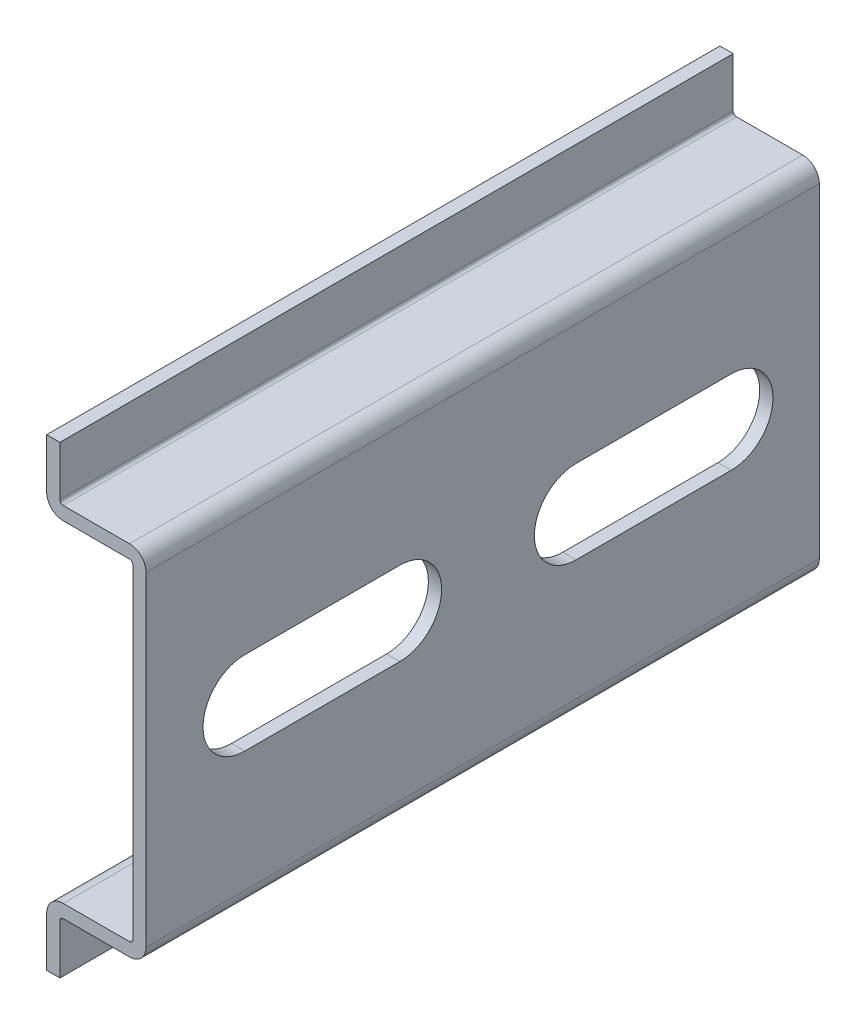
ISO-10303-21;
HEADER;
FILE_DESCRIPTION(('STEP AP214'),'2;1');
FILE_NAME('part.step','',(''),(''),'','','');
FILE_SCHEMA(('AUTOMOTIVE_DESIGN { 1 0 10303 214 1 1 1 1 }'));
ENDSEC;
DATA;
#1=APPLICATION_CONTEXT('core data for automotive mechanical design processes');
#2=APPLICATION_PROTOCOL_DEFINITION('international standard','automotive_design',2000,#1);
#3=PRODUCT_CONTEXT('',#1,'mechanical');
#4=PRODUCT('Part','Part','',(#3));
#5=PRODUCT_RELATED_PRODUCT_CATEGORY('part','',(#4));
#6=PRODUCT_DEFINITION_FORMATION('','',#4);
#7=PRODUCT_DEFINITION_CONTEXT('part definition',#1,'design');
#8=PRODUCT_DEFINITION('design','',#6,#7);
#9=PRODUCT_DEFINITION_SHAPE('','',#8);
#10=(LENGTH_UNIT() NAMED_UNIT(*) SI_UNIT(.MILLI.,.METRE.));
#11=(NAMED_UNIT(*) PLANE_ANGLE_UNIT() SI_UNIT($,.RADIAN.));
#12=(NAMED_UNIT(*) SI_UNIT($,.STERADIAN.) SOLID_ANGLE_UNIT());
#13=UNCERTAINTY_MEASURE_WITH_UNIT(LENGTH_MEASURE(1.E-05),#10,'distance_accuracy_value','');
#14=(GEOMETRIC_REPRESENTATION_CONTEXT(3) GLOBAL_UNCERTAINTY_ASSIGNED_CONTEXT((#13)) GLOBAL_UNIT_ASSIGNED_CONTEXT((#10,
#11,#12)) REPRESENTATION_CONTEXT('',''));
#15=CARTESIAN_POINT('',(0.,0.,0.));
#16=DIRECTION('',(0.,0.,1.));
#17=DIRECTION('',(1.,0.,0.));
#18=AXIS2_PLACEMENT_3D('',#15,#16,#17);
#19=CARTESIAN_POINT('',(-6.5,13.5,50.8));
#20=DIRECTION('',(-1.,0.,0.));
#21=DIRECTION('',(0.,-1.,0.));
#22=AXIS2_PLACEMENT_3D('',#19,#20,#21);
#23=PLANE('',#22);
#24=DIRECTION('',(0.,1.,0.));
#25=VECTOR('',#24,1.);
#26=CARTESIAN_POINT('',(-6.5,13.5,50.8));
#27=LINE('',#26,#25);
#28=CARTESIAN_POINT('',(-6.5,13.75,50.8));
#29=VERTEX_POINT('',#28);
#30=CARTESIAN_POINT('',(-6.5,17.5,50.8));
#31=VERTEX_POINT('',#30);
#32=EDGE_CURVE('E314',#29,#31,#27,.T.);
#33=ORIENTED_EDGE('',*,*,#32,.F.);
#34=DIRECTION('',(0.,0.,-1.));
#35=VECTOR('',#34,1.);
#36=CARTESIAN_POINT('',(-6.5,13.75,0.));
#37=LINE('',#36,#35);
#38=CARTESIAN_POINT('',(-6.5,13.75,0.));
#39=VERTEX_POINT('',#38);
#40=EDGE_CURVE('E425',#29,#39,#37,.T.);
#41=ORIENTED_EDGE('',*,*,#40,.T.);
#42=DIRECTION('',(0.,1.,0.));
#43=VECTOR('',#42,1.);
#44=CARTESIAN_POINT('',(-6.5,13.5,0.));
#45=LINE('',#44,#43);
#46=CARTESIAN_POINT('',(-6.5,17.5,0.));
#47=VERTEX_POINT('',#46);
#48=EDGE_CURVE('E313',#39,#47,#45,.T.);
#49=ORIENTED_EDGE('',*,*,#48,.T.);
#50=DIRECTION('',(0.,0.,-1.));
#51=VECTOR('',#50,1.);
#52=CARTESIAN_POINT('',(-6.5,17.5,50.8));
#53=LINE('',#52,#51);
#54=EDGE_CURVE('E394',#31,#47,#53,.T.);
#55=ORIENTED_EDGE('',*,*,#54,.F.);
#56=EDGE_LOOP('',(#33,#41,#49,#55));
#57=FACE_BOUND('',#56,.T.);
#58=ADVANCED_FACE('F41',(#57),#23,.F.);
#59=CARTESIAN_POINT('',(-7.5,17.5,50.8));
#60=DIRECTION('',(0.,1.,0.));
#61=DIRECTION('',(0.,0.,1.));
#62=AXIS2_PLACEMENT_3D('',#59,#60,#61);
#63=PLANE('',#62);
#64=DIRECTION('',(1.,0.,0.));
#65=VECTOR('',#64,1.);
#66=CARTESIAN_POINT('',(-7.5,17.5,0.));
#67=LINE('',#66,#65);
#68=CARTESIAN_POINT('',(-7.5,17.5,0.));
#69=VERTEX_POINT('',#68);
#70=EDGE_CURVE('E355',#69,#47,#67,.T.);
#71=ORIENTED_EDGE('',*,*,#70,.F.);
#72=DIRECTION('',(0.,0.,-1.));
#73=VECTOR('',#72,1.);
#74=CARTESIAN_POINT('',(-7.5,17.5,50.8));
#75=LINE('',#74,#73);
#76=CARTESIAN_POINT('',(-7.5,17.5,50.8));
#77=VERTEX_POINT('',#76);
#78=EDGE_CURVE('E390',#77,#69,#75,.T.);
#79=ORIENTED_EDGE('',*,*,#78,.F.);
#80=DIRECTION('',(1.,0.,0.));
#81=VECTOR('',#80,1.);
#82=CARTESIAN_POINT('',(-7.5,17.5,50.8));
#83=LINE('',#82,#81);
#84=EDGE_CURVE('E316',#77,#31,#83,.T.);
#85=ORIENTED_EDGE('',*,*,#84,.T.);
#86=ORIENTED_EDGE('',*,*,#54,.T.);
#87=EDGE_LOOP('',(#71,#79,#85,#86));
#88=FACE_BOUND('',#87,.T.);
#89=ADVANCED_FACE('F593',(#88),#63,.T.);
#90=CARTESIAN_POINT('',(-7.5,13.5,50.8));
#91=DIRECTION('',(-1.,0.,0.));
#92=DIRECTION('',(0.,-1.,0.));
#93=AXIS2_PLACEMENT_3D('',#90,#91,#92);
#94=PLANE('',#93);
#95=DIRECTION('',(0.,1.,0.));
#96=VECTOR('',#95,1.);
#97=CARTESIAN_POINT('',(-7.5,13.5,0.));
#98=LINE('',#97,#96);
#99=CARTESIAN_POINT('',(-7.5,13.75,0.));
#100=VERTEX_POINT('',#99);
#101=EDGE_CURVE('E359',#100,#69,#98,.T.);
#102=ORIENTED_EDGE('',*,*,#101,.F.);
#103=DIRECTION('',(0.,0.,-1.));
#104=VECTOR('',#103,1.);
#105=CARTESIAN_POINT('',(-7.5,13.75,50.8));
#106=LINE('',#105,#104);
#107=CARTESIAN_POINT('',(-7.5,13.75,50.8));
#108=VERTEX_POINT('',#107);
#109=EDGE_CURVE('E11',#100,#108,#106,.F.);
#110=ORIENTED_EDGE('',*,*,#109,.T.);
#111=DIRECTION('',(0.,1.,0.));
#112=VECTOR('',#111,1.);
#113=CARTESIAN_POINT('',(-7.5,13.5,50.8));
#114=LINE('',#113,#112);
#115=EDGE_CURVE('E320',#108,#77,#114,.T.);
#116=ORIENTED_EDGE('',*,*,#115,.T.);
#117=ORIENTED_EDGE('',*,*,#78,.T.);
#118=EDGE_LOOP('',(#102,#110,#116,#117));
#119=FACE_BOUND('',#118,.T.);
#120=ADVANCED_FACE('F597',(#119),#94,.T.);
#121=CARTESIAN_POINT('',(0.,12.5,50.8));
#122=DIRECTION('',(0.,-1.,0.));
#123=DIRECTION('',(1.,0.,0.));
#124=AXIS2_PLACEMENT_3D('',#121,#122,#123);
#125=PLANE('',#124);
#126=DIRECTION('',(-1.,0.,0.));
#127=VECTOR('',#126,1.);
#128=CARTESIAN_POINT('',(0.,12.5,50.8));
#129=LINE('',#128,#127);
#130=CARTESIAN_POINT('',(-1.25,12.5,50.8));
#131=VERTEX_POINT('',#130);
#132=CARTESIAN_POINT('',(-6.25,12.5,50.8));
#133=VERTEX_POINT('',#132);
#134=EDGE_CURVE('E322',#131,#133,#129,.T.);
#135=ORIENTED_EDGE('',*,*,#134,.T.);
#136=DIRECTION('',(0.,0.,-1.));
#137=VECTOR('',#136,1.);
#138=CARTESIAN_POINT('',(-6.25,12.5,50.8));
#139=LINE('',#138,#137);
#140=CARTESIAN_POINT('',(-6.25,12.5,0.));
#141=VERTEX_POINT('',#140);
#142=EDGE_CURVE('E50',#133,#141,#139,.T.);
#143=ORIENTED_EDGE('',*,*,#142,.T.);
#144=DIRECTION('',(-1.,0.,0.));
#145=VECTOR('',#144,1.);
#146=CARTESIAN_POINT('',(0.,12.5,0.));
#147=LINE('',#146,#145);
#148=CARTESIAN_POINT('',(-1.25,12.5,0.));
#149=VERTEX_POINT('',#148);
#150=EDGE_CURVE('E362',#149,#141,#147,.T.);
#151=ORIENTED_EDGE('',*,*,#150,.F.);
#152=DIRECTION('',(0.,0.,-1.));
#153=VECTOR('',#152,1.);
#154=CARTESIAN_POINT('',(-1.25,12.5,50.8));
#155=LINE('',#154,#153);
#156=EDGE_CURVE('E447',#149,#131,#155,.F.);
#157=ORIENTED_EDGE('',*,*,#156,.T.);
#158=EDGE_LOOP('',(#135,#143,#151,#157));
#159=FACE_BOUND('',#158,.T.);
#160=ADVANCED_FACE('F515',(#159),#125,.T.);
#161=CARTESIAN_POINT('',(-1.,-13.5,50.8));
#162=DIRECTION('',(-1.,0.,0.));
#163=DIRECTION('',(0.,-1.,0.));
#164=AXIS2_PLACEMENT_3D('',#161,#162,#163);
#165=PLANE('',#164);
#166=CARTESIAN_POINT('',(-1.,0.,31.65));
#167=DIRECTION('',(-1.,0.,0.));
#168=DIRECTION('',(0.,-1.,0.));
#169=AXIS2_PLACEMENT_3D('',#166,#167,#168);
#170=CIRCLE('',#169,3.14999999999999);
#171=CARTESIAN_POINT('',(-1.00000000000001,3.14999999999999,31.65));
#172=VERTEX_POINT('',#171);
#173=CARTESIAN_POINT('',(-1.,-3.15,31.65));
#174=VERTEX_POINT('',#173);
#175=EDGE_CURVE('E269',#172,#174,#170,.T.);
#176=ORIENTED_EDGE('',*,*,#175,.F.);
#177=DIRECTION('',(0.,0.,-1.));
#178=VECTOR('',#177,1.);
#179=CARTESIAN_POINT('',(-1.,3.14999999999999,50.8));
#180=LINE('',#179,#178);
#181=CARTESIAN_POINT('',(-1.,3.14999999999999,43.35));
#182=VERTEX_POINT('',#181);
#183=EDGE_CURVE('E251',#182,#172,#180,.T.);
#184=ORIENTED_EDGE('',*,*,#183,.F.);
#185=CARTESIAN_POINT('',(-1.,0.,43.35));
#186=DIRECTION('',(-1.,0.,0.));
#187=DIRECTION('',(0.,-1.,0.));
#188=AXIS2_PLACEMENT_3D('',#185,#186,#187);
#189=CIRCLE('',#188,3.14999999999999);
#190=CARTESIAN_POINT('',(-1.,-3.15,43.35));
#191=VERTEX_POINT('',#190);
#192=EDGE_CURVE('E263',#191,#182,#189,.T.);
#193=ORIENTED_EDGE('',*,*,#192,.F.);
#194=DIRECTION('',(0.,0.,1.));
#195=VECTOR('',#194,1.);
#196=CARTESIAN_POINT('',(-1.,-3.15,50.8));
#197=LINE('',#196,#195);
#198=EDGE_CURVE('E279',#174,#191,#197,.T.);
#199=ORIENTED_EDGE('',*,*,#198,.F.);
#200=EDGE_LOOP('',(#176,#184,#193,#199));
#201=FACE_BOUND('',#200,.T.);
#202=CARTESIAN_POINT('',(-1.,0.,6.65));
#203=DIRECTION('',(-1.,0.,0.));
#204=DIRECTION('',(0.,-1.,0.));
#205=AXIS2_PLACEMENT_3D('',#202,#203,#204);
#206=CIRCLE('',#205,3.14999999999999);
#207=CARTESIAN_POINT('',(-1.00000000000001,3.14999999999999,6.65));
#208=VERTEX_POINT('',#207);
#209=CARTESIAN_POINT('',(-1.,-3.15,6.65));
#210=VERTEX_POINT('',#209);
#211=EDGE_CURVE('E311',#208,#210,#206,.T.);
#212=ORIENTED_EDGE('',*,*,#211,.F.);
#213=DIRECTION('',(0.,0.,-1.));
#214=VECTOR('',#213,1.);
#215=CARTESIAN_POINT('',(-1.,3.15,50.8));
#216=LINE('',#215,#214);
#217=CARTESIAN_POINT('',(-1.,3.14999999999999,18.35));
#218=VERTEX_POINT('',#217);
#219=EDGE_CURVE('E297',#218,#208,#216,.T.);
#220=ORIENTED_EDGE('',*,*,#219,.F.);
#221=CARTESIAN_POINT('',(-1.,0.,18.35));
#222=DIRECTION('',(-1.,0.,0.));
#223=DIRECTION('',(0.,-1.,0.));
#224=AXIS2_PLACEMENT_3D('',#221,#222,#223);
#225=CIRCLE('',#224,3.14999999999999);
#226=CARTESIAN_POINT('',(-1.,-3.15,18.35));
#227=VERTEX_POINT('',#226);
#228=EDGE_CURVE('E304',#227,#218,#225,.T.);
#229=ORIENTED_EDGE('',*,*,#228,.F.);
#230=DIRECTION('',(0.,0.,1.));
#231=VECTOR('',#230,1.);
#232=CARTESIAN_POINT('',(-1.,-3.14999999999999,50.8));
#233=LINE('',#232,#231);
#234=EDGE_CURVE('E308',#210,#227,#233,.T.);
#235=ORIENTED_EDGE('',*,*,#234,.F.);
#236=EDGE_LOOP('',(#212,#220,#229,#235));
#237=FACE_BOUND('',#236,.T.);
#238=DIRECTION('',(0.,1.,0.));
#239=VECTOR('',#238,1.);
#240=CARTESIAN_POINT('',(-1.,-13.5,50.8));
#241=LINE('',#240,#239);
#242=CARTESIAN_POINT('',(-1.,-12.25,50.8));
#243=VERTEX_POINT('',#242);
#244=CARTESIAN_POINT('',(-1.,12.25,50.8));
#245=VERTEX_POINT('',#244);
#246=EDGE_CURVE('E325',#243,#245,#241,.T.);
#247=ORIENTED_EDGE('',*,*,#246,.T.);
#248=DIRECTION('',(0.,0.,-1.));
#249=VECTOR('',#248,1.);
#250=CARTESIAN_POINT('',(-1.,12.25,0.));
#251=LINE('',#250,#249);
#252=CARTESIAN_POINT('',(-1.,12.25,0.));
#253=VERTEX_POINT('',#252);
#254=EDGE_CURVE('E443',#245,#253,#251,.T.);
#255=ORIENTED_EDGE('',*,*,#254,.T.);
#256=DIRECTION('',(0.,1.,0.));
#257=VECTOR('',#256,1.);
#258=CARTESIAN_POINT('',(-1.,-13.5,0.));
#259=LINE('',#258,#257);
#260=CARTESIAN_POINT('',(-1.,-12.25,0.));
#261=VERTEX_POINT('',#260);
#262=EDGE_CURVE('E365',#261,#253,#259,.T.);
#263=ORIENTED_EDGE('',*,*,#262,.F.);
#264=DIRECTION('',(0.,0.,-1.));
#265=VECTOR('',#264,1.);
#266=CARTESIAN_POINT('',(-1.,-12.25,50.8));
#267=LINE('',#266,#265);
#268=EDGE_CURVE('E440',#261,#243,#267,.F.);
#269=ORIENTED_EDGE('',*,*,#268,.T.);
#270=EDGE_LOOP('',(#247,#255,#263,#269));
#271=FACE_BOUND('',#270,.T.);
#272=ADVANCED_FACE('F277',(#201,#237,#271),#165,.T.);
#273=CARTESIAN_POINT('',(0.,-12.5,50.8));
#274=DIRECTION('',(0.,1.,0.));
#275=DIRECTION('',(-1.,0.,0.));
#276=AXIS2_PLACEMENT_3D('',#273,#274,#275);
#277=PLANE('',#276);
#278=DIRECTION('',(1.,0.,0.));
#279=VECTOR('',#278,1.);
#280=CARTESIAN_POINT('',(0.,-12.5,0.));
#281=LINE('',#280,#279);
#282=CARTESIAN_POINT('',(-6.25,-12.5,0.));
#283=VERTEX_POINT('',#282);
#284=CARTESIAN_POINT('',(-1.25,-12.5,0.));
#285=VERTEX_POINT('',#284);
#286=EDGE_CURVE('E368',#283,#285,#281,.T.);
#287=ORIENTED_EDGE('',*,*,#286,.F.);
#288=DIRECTION('',(0.,0.,-1.));
#289=VECTOR('',#288,1.);
#290=CARTESIAN_POINT('',(-6.25,-12.5,50.8));
#291=LINE('',#290,#289);
#292=CARTESIAN_POINT('',(-6.25,-12.5,50.8));
#293=VERTEX_POINT('',#292);
#294=EDGE_CURVE('E486',#283,#293,#291,.F.);
#295=ORIENTED_EDGE('',*,*,#294,.T.);
#296=DIRECTION('',(1.,0.,0.));
#297=VECTOR('',#296,1.);
#298=CARTESIAN_POINT('',(0.,-12.5,50.8));
#299=LINE('',#298,#297);
#300=CARTESIAN_POINT('',(-1.25,-12.5,50.8));
#301=VERTEX_POINT('',#300);
#302=EDGE_CURVE('E329',#293,#301,#299,.T.);
#303=ORIENTED_EDGE('',*,*,#302,.T.);
#304=DIRECTION('',(0.,0.,-1.));
#305=VECTOR('',#304,1.);
#306=CARTESIAN_POINT('',(-1.25,-12.5,0.));
#307=LINE('',#306,#305);
#308=EDGE_CURVE('E450',#301,#285,#307,.T.);
#309=ORIENTED_EDGE('',*,*,#308,.T.);
#310=EDGE_LOOP('',(#287,#295,#303,#309));
#311=FACE_BOUND('',#310,.T.);
#312=ADVANCED_FACE('F540',(#311),#277,.T.);
#313=CARTESIAN_POINT('',(-7.5,-13.5,50.8));
#314=DIRECTION('',(-1.,0.,0.));
#315=DIRECTION('',(0.,-1.,0.));
#316=AXIS2_PLACEMENT_3D('',#313,#314,#315);
#317=PLANE('',#316);
#318=DIRECTION('',(0.,1.,0.));
#319=VECTOR('',#318,1.);
#320=CARTESIAN_POINT('',(-7.5,-13.5,50.8));
#321=LINE('',#320,#319);
#322=CARTESIAN_POINT('',(-7.5,-17.5,50.8));
#323=VERTEX_POINT('',#322);
#324=CARTESIAN_POINT('',(-7.5,-13.75,50.8));
#325=VERTEX_POINT('',#324);
#326=EDGE_CURVE('E332',#323,#325,#321,.T.);
#327=ORIENTED_EDGE('',*,*,#326,.T.);
#328=DIRECTION('',(0.,0.,-1.));
#329=VECTOR('',#328,1.);
#330=CARTESIAN_POINT('',(-7.5,-13.75,50.8));
#331=LINE('',#330,#329);
#332=CARTESIAN_POINT('',(-7.5,-13.75,0.));
#333=VERTEX_POINT('',#332);
#334=EDGE_CURVE('E474',#325,#333,#331,.T.);
#335=ORIENTED_EDGE('',*,*,#334,.T.);
#336=DIRECTION('',(0.,1.,0.));
#337=VECTOR('',#336,1.);
#338=CARTESIAN_POINT('',(-7.5,-13.5,0.));
#339=LINE('',#338,#337);
#340=CARTESIAN_POINT('',(-7.5,-17.5,0.));
#341=VERTEX_POINT('',#340);
#342=EDGE_CURVE('E370',#341,#333,#339,.T.);
#343=ORIENTED_EDGE('',*,*,#342,.F.);
#344=DIRECTION('',(0.,0.,-1.));
#345=VECTOR('',#344,1.);
#346=CARTESIAN_POINT('',(-7.5,-17.5,50.8));
#347=LINE('',#346,#345);
#348=EDGE_CURVE('E387',#323,#341,#347,.T.);
#349=ORIENTED_EDGE('',*,*,#348,.F.);
#350=EDGE_LOOP('',(#327,#335,#343,#349));
#351=FACE_BOUND('',#350,.T.);
#352=ADVANCED_FACE('F549',(#351),#317,.T.);
#353=CARTESIAN_POINT('',(-6.5,-17.5,50.8));
#354=DIRECTION('',(0.,-1.,0.));
#355=DIRECTION('',(0.,0.,-1.));
#356=AXIS2_PLACEMENT_3D('',#353,#354,#355);
#357=PLANE('',#356);
#358=DIRECTION('',(-1.,0.,0.));
#359=VECTOR('',#358,1.);
#360=CARTESIAN_POINT('',(-6.5,-17.5,0.));
#361=LINE('',#360,#359);
#362=CARTESIAN_POINT('',(-6.5,-17.5,0.));
#363=VERTEX_POINT('',#362);
#364=EDGE_CURVE('E373',#363,#341,#361,.T.);
#365=ORIENTED_EDGE('',*,*,#364,.F.);
#366=DIRECTION('',(0.,0.,-1.));
#367=VECTOR('',#366,1.);
#368=CARTESIAN_POINT('',(-6.5,-17.5,50.8));
#369=LINE('',#368,#367);
#370=CARTESIAN_POINT('',(-6.5,-17.5,50.8));
#371=VERTEX_POINT('',#370);
#372=EDGE_CURVE('E352',#371,#363,#369,.T.);
#373=ORIENTED_EDGE('',*,*,#372,.F.);
#374=DIRECTION('',(-1.,0.,0.));
#375=VECTOR('',#374,1.);
#376=CARTESIAN_POINT('',(-6.5,-17.5,50.8));
#377=LINE('',#376,#375);
#378=EDGE_CURVE('E336',#371,#323,#377,.T.);
#379=ORIENTED_EDGE('',*,*,#378,.T.);
#380=ORIENTED_EDGE('',*,*,#348,.T.);
#381=EDGE_LOOP('',(#365,#373,#379,#380));
#382=FACE_BOUND('',#381,.T.);
#383=ADVANCED_FACE('F553',(#382),#357,.T.);
#384=CARTESIAN_POINT('',(-6.5,-13.5,50.8));
#385=DIRECTION('',(-1.,0.,0.));
#386=DIRECTION('',(0.,-1.,0.));
#387=AXIS2_PLACEMENT_3D('',#384,#385,#386);
#388=PLANE('',#387);
#389=DIRECTION('',(0.,1.,0.));
#390=VECTOR('',#389,1.);
#391=CARTESIAN_POINT('',(-6.5,-13.5,0.));
#392=LINE('',#391,#390);
#393=CARTESIAN_POINT('',(-6.5,-13.75,0.));
#394=VERTEX_POINT('',#393);
#395=EDGE_CURVE('E376',#363,#394,#392,.T.);
#396=ORIENTED_EDGE('',*,*,#395,.T.);
#397=DIRECTION('',(0.,0.,-1.));
#398=VECTOR('',#397,1.);
#399=CARTESIAN_POINT('',(-6.5,-13.75,50.8));
#400=LINE('',#399,#398);
#401=CARTESIAN_POINT('',(-6.5,-13.75,50.8));
#402=VERTEX_POINT('',#401);
#403=EDGE_CURVE('E437',#394,#402,#400,.F.);
#404=ORIENTED_EDGE('',*,*,#403,.T.);
#405=DIRECTION('',(0.,1.,0.));
#406=VECTOR('',#405,1.);
#407=CARTESIAN_POINT('',(-6.5,-13.5,50.8));
#408=LINE('',#407,#406);
#409=EDGE_CURVE('E340',#371,#402,#408,.T.);
#410=ORIENTED_EDGE('',*,*,#409,.F.);
#411=ORIENTED_EDGE('',*,*,#372,.T.);
#412=EDGE_LOOP('',(#396,#404,#410,#411));
#413=FACE_BOUND('',#412,.T.);
#414=ADVANCED_FACE('F749',(#413),#388,.F.);
#415=CARTESIAN_POINT('',(0.,-13.5,50.8));
#416=DIRECTION('',(0.,1.,0.));
#417=DIRECTION('',(-1.,0.,0.));
#418=AXIS2_PLACEMENT_3D('',#415,#416,#417);
#419=PLANE('',#418);
#420=DIRECTION('',(1.,0.,0.));
#421=VECTOR('',#420,1.);
#422=CARTESIAN_POINT('',(0.,-13.5,0.));
#423=LINE('',#422,#421);
#424=CARTESIAN_POINT('',(-6.25,-13.5,0.));
#425=VERTEX_POINT('',#424);
#426=CARTESIAN_POINT('',(-1.25,-13.5,0.));
#427=VERTEX_POINT('',#426);
#428=EDGE_CURVE('E379',#425,#427,#423,.T.);
#429=ORIENTED_EDGE('',*,*,#428,.T.);
#430=DIRECTION('',(0.,0.,-1.));
#431=VECTOR('',#430,1.);
#432=CARTESIAN_POINT('',(-1.25,-13.5,50.8));
#433=LINE('',#432,#431);
#434=CARTESIAN_POINT('',(-1.25,-13.5,50.8));
#435=VERTEX_POINT('',#434);
#436=EDGE_CURVE('E504',#427,#435,#433,.F.);
#437=ORIENTED_EDGE('',*,*,#436,.T.);
#438=DIRECTION('',(1.,0.,0.));
#439=VECTOR('',#438,1.);
#440=CARTESIAN_POINT('',(0.,-13.5,50.8));
#441=LINE('',#440,#439);
#442=CARTESIAN_POINT('',(-6.25,-13.5,50.8));
#443=VERTEX_POINT('',#442);
#444=EDGE_CURVE('E344',#443,#435,#441,.T.);
#445=ORIENTED_EDGE('',*,*,#444,.F.);
#446=DIRECTION('',(0.,0.,-1.));
#447=VECTOR('',#446,1.);
#448=CARTESIAN_POINT('',(-6.25,-13.5,0.));
#449=LINE('',#448,#447);
#450=EDGE_CURVE('E433',#443,#425,#449,.T.);
#451=ORIENTED_EDGE('',*,*,#450,.T.);
#452=EDGE_LOOP('',(#429,#437,#445,#451));
#453=FACE_BOUND('',#452,.T.);
#454=ADVANCED_FACE('F565',(#453),#419,.F.);
#455=CARTESIAN_POINT('',(0.,-13.5,50.8));
#456=DIRECTION('',(-1.,0.,0.));
#457=DIRECTION('',(0.,-1.,0.));
#458=AXIS2_PLACEMENT_3D('',#455,#456,#457);
#459=PLANE('',#458);
#460=DIRECTION('',(0.,0.,1.));
#461=VECTOR('',#460,1.);
#462=CARTESIAN_POINT('',(0.,3.14999999999999,50.8));
#463=LINE('',#462,#461);
#464=CARTESIAN_POINT('',(0.,3.15,43.35));
#465=VERTEX_POINT('',#464);
#466=CARTESIAN_POINT('',(0.,3.14999999999999,31.65));
#467=VERTEX_POINT('',#466);
#468=EDGE_CURVE('E413',#465,#467,#463,.F.);
#469=ORIENTED_EDGE('',*,*,#468,.T.);
#470=CARTESIAN_POINT('',(0.,0.,31.65));
#471=DIRECTION('',(1.,0.,0.));
#472=DIRECTION('',(0.,0.,-1.));
#473=AXIS2_PLACEMENT_3D('',#470,#471,#472);
#474=CIRCLE('',#473,3.14999999999999);
#475=CARTESIAN_POINT('',(0.,-3.15,31.65));
#476=VERTEX_POINT('',#475);
#477=EDGE_CURVE('E272',#467,#476,#474,.F.);
#478=ORIENTED_EDGE('',*,*,#477,.T.);
#479=DIRECTION('',(0.,0.,1.));
#480=VECTOR('',#479,1.);
#481=CARTESIAN_POINT('',(0.,-3.15,50.8));
#482=LINE('',#481,#480);
#483=CARTESIAN_POINT('',(0.,-3.15,43.35));
#484=VERTEX_POINT('',#483);
#485=EDGE_CURVE('E419',#476,#484,#482,.T.);
#486=ORIENTED_EDGE('',*,*,#485,.T.);
#487=CARTESIAN_POINT('',(0.,0.,43.35));
#488=DIRECTION('',(1.,0.,0.));
#489=DIRECTION('',(0.,0.,-1.));
#490=AXIS2_PLACEMENT_3D('',#487,#488,#489);
#491=CIRCLE('',#490,3.14999999999999);
#492=EDGE_CURVE('E415',#484,#465,#491,.F.);
#493=ORIENTED_EDGE('',*,*,#492,.T.);
#494=EDGE_LOOP('',(#469,#478,#486,#493));
#495=FACE_BOUND('',#494,.T.);
#496=DIRECTION('',(0.,0.,1.));
#497=VECTOR('',#496,1.);
#498=CARTESIAN_POINT('',(0.,3.14999999999999,50.8));
#499=LINE('',#498,#497);
#500=CARTESIAN_POINT('',(0.,3.15,18.35));
#501=VERTEX_POINT('',#500);
#502=CARTESIAN_POINT('',(0.,3.14999999999999,6.65));
#503=VERTEX_POINT('',#502);
#504=EDGE_CURVE('E398',#501,#503,#499,.F.);
#505=ORIENTED_EDGE('',*,*,#504,.T.);
#506=CARTESIAN_POINT('',(0.,0.,6.65));
#507=DIRECTION('',(1.,0.,0.));
#508=DIRECTION('',(0.,0.,-1.));
#509=AXIS2_PLACEMENT_3D('',#506,#507,#508);
#510=CIRCLE('',#509,3.14999999999999);
#511=CARTESIAN_POINT('',(0.,-3.15,6.65));
#512=VERTEX_POINT('',#511);
#513=EDGE_CURVE('E410',#503,#512,#510,.F.);
#514=ORIENTED_EDGE('',*,*,#513,.T.);
#515=DIRECTION('',(0.,0.,1.));
#516=VECTOR('',#515,1.);
#517=CARTESIAN_POINT('',(0.,-3.15,50.8));
#518=LINE('',#517,#516);
#519=CARTESIAN_POINT('',(0.,-3.15,18.35));
#520=VERTEX_POINT('',#519);
#521=EDGE_CURVE('E406',#512,#520,#518,.T.);
#522=ORIENTED_EDGE('',*,*,#521,.T.);
#523=CARTESIAN_POINT('',(0.,0.,18.35));
#524=DIRECTION('',(1.,0.,0.));
#525=DIRECTION('',(0.,0.,-1.));
#526=AXIS2_PLACEMENT_3D('',#523,#524,#525);
#527=CIRCLE('',#526,3.14999999999999);
#528=EDGE_CURVE('E402',#520,#501,#527,.F.);
#529=ORIENTED_EDGE('',*,*,#528,.T.);
#530=EDGE_LOOP('',(#505,#514,#522,#529));
#531=FACE_BOUND('',#530,.T.);
#532=DIRECTION('',(0.,1.,0.));
#533=VECTOR('',#532,1.);
#534=CARTESIAN_POINT('',(0.,-13.5,50.8));
#535=LINE('',#534,#533);
#536=CARTESIAN_POINT('',(0.,-12.25,50.8));
#537=VERTEX_POINT('',#536);
#538=CARTESIAN_POINT('',(0.,12.25,50.8));
#539=VERTEX_POINT('',#538);
#540=EDGE_CURVE('E347',#537,#539,#535,.T.);
#541=ORIENTED_EDGE('',*,*,#540,.F.);
#542=DIRECTION('',(0.,0.,-1.));
#543=VECTOR('',#542,1.);
#544=CARTESIAN_POINT('',(0.,-12.25,50.8));
#545=LINE('',#544,#543);
#546=CARTESIAN_POINT('',(0.,-12.25,0.));
#547=VERTEX_POINT('',#546);
#548=EDGE_CURVE('E500',#537,#547,#545,.T.);
#549=ORIENTED_EDGE('',*,*,#548,.T.);
#550=DIRECTION('',(0.,1.,0.));
#551=VECTOR('',#550,1.);
#552=CARTESIAN_POINT('',(0.,-13.5,0.));
#553=LINE('',#552,#551);
#554=CARTESIAN_POINT('',(0.,12.25,0.));
#555=VERTEX_POINT('',#554);
#556=EDGE_CURVE('E382',#547,#555,#553,.T.);
#557=ORIENTED_EDGE('',*,*,#556,.T.);
#558=DIRECTION('',(0.,0.,-1.));
#559=VECTOR('',#558,1.);
#560=CARTESIAN_POINT('',(0.,12.25,50.8));
#561=LINE('',#560,#559);
#562=EDGE_CURVE('E57',#555,#539,#561,.F.);
#563=ORIENTED_EDGE('',*,*,#562,.T.);
#564=EDGE_LOOP('',(#541,#549,#557,#563));
#565=FACE_BOUND('',#564,.T.);
#566=ADVANCED_FACE('F571',(#495,#531,#565),#459,.F.);
#567=CARTESIAN_POINT('',(0.,13.5,50.8));
#568=DIRECTION('',(0.,-1.,0.));
#569=DIRECTION('',(1.,0.,0.));
#570=AXIS2_PLACEMENT_3D('',#567,#568,#569);
#571=PLANE('',#570);
#572=DIRECTION('',(-1.,0.,0.));
#573=VECTOR('',#572,1.);
#574=CARTESIAN_POINT('',(0.,13.5,50.8));
#575=LINE('',#574,#573);
#576=CARTESIAN_POINT('',(-1.25000000000001,13.5,50.8));
#577=VERTEX_POINT('',#576);
#578=CARTESIAN_POINT('',(-6.25,13.5,50.8));
#579=VERTEX_POINT('',#578);
#580=EDGE_CURVE('E350',#577,#579,#575,.T.);
#581=ORIENTED_EDGE('',*,*,#580,.F.);
#582=DIRECTION('',(0.,0.,-1.));
#583=VECTOR('',#582,1.);
#584=CARTESIAN_POINT('',(-1.25000000000001,13.5,50.8));
#585=LINE('',#584,#583);
#586=CARTESIAN_POINT('',(-1.25000000000001,13.5,0.));
#587=VERTEX_POINT('',#586);
#588=EDGE_CURVE('E507',#577,#587,#585,.T.);
#589=ORIENTED_EDGE('',*,*,#588,.T.);
#590=DIRECTION('',(-1.,0.,0.));
#591=VECTOR('',#590,1.);
#592=CARTESIAN_POINT('',(0.,13.5,0.));
#593=LINE('',#592,#591);
#594=CARTESIAN_POINT('',(-6.25,13.5,0.));
#595=VERTEX_POINT('',#594);
#596=EDGE_CURVE('E317',#587,#595,#593,.T.);
#597=ORIENTED_EDGE('',*,*,#596,.T.);
#598=DIRECTION('',(0.,0.,-1.));
#599=VECTOR('',#598,1.);
#600=CARTESIAN_POINT('',(-6.25,13.5,50.8));
#601=LINE('',#600,#599);
#602=EDGE_CURVE('E429',#595,#579,#601,.F.);
#603=ORIENTED_EDGE('',*,*,#602,.T.);
#604=EDGE_LOOP('',(#581,#589,#597,#603));
#605=FACE_BOUND('',#604,.T.);
#606=ADVANCED_FACE('F579',(#605),#571,.F.);
#607=CARTESIAN_POINT('',(0.,0.,50.8));
#608=DIRECTION('',(0.,0.,-1.));
#609=DIRECTION('',(-1.,0.,0.));
#610=AXIS2_PLACEMENT_3D('',#607,#608,#609);
#611=PLANE('',#610);
#612=ORIENTED_EDGE('',*,*,#302,.F.);
#613=CARTESIAN_POINT('',(-6.25,-13.75,50.8));
#614=DIRECTION('',(0.,0.,-1.));
#615=DIRECTION('',(-1.,0.,0.));
#616=AXIS2_PLACEMENT_3D('',#613,#614,#615);
#617=CIRCLE('',#616,1.25);
#618=EDGE_CURVE('E495',#293,#325,#617,.F.);
#619=ORIENTED_EDGE('',*,*,#618,.T.);
#620=ORIENTED_EDGE('',*,*,#326,.F.);
#621=ORIENTED_EDGE('',*,*,#378,.F.);
#622=ORIENTED_EDGE('',*,*,#409,.T.);
#623=CARTESIAN_POINT('',(-6.25,-13.75,50.8));
#624=DIRECTION('',(0.,0.,-1.));
#625=DIRECTION('',(-1.,0.,0.));
#626=AXIS2_PLACEMENT_3D('',#623,#624,#625);
#627=CIRCLE('',#626,0.25);
#628=EDGE_CURVE('E461',#402,#443,#627,.T.);
#629=ORIENTED_EDGE('',*,*,#628,.T.);
#630=ORIENTED_EDGE('',*,*,#444,.T.);
#631=CARTESIAN_POINT('',(-1.25,-12.25,50.8));
#632=DIRECTION('',(0.,0.,-1.));
#633=DIRECTION('',(-1.,0.,0.));
#634=AXIS2_PLACEMENT_3D('',#631,#632,#633);
#635=CIRCLE('',#634,1.25);
#636=EDGE_CURVE('E67',#435,#537,#635,.F.);
#637=ORIENTED_EDGE('',*,*,#636,.T.);
#638=ORIENTED_EDGE('',*,*,#540,.T.);
#639=CARTESIAN_POINT('',(-1.25,12.25,50.8));
#640=DIRECTION('',(0.,0.,-1.));
#641=DIRECTION('',(-1.,0.,0.));
#642=AXIS2_PLACEMENT_3D('',#639,#640,#641);
#643=CIRCLE('',#642,1.25);
#644=EDGE_CURVE('E491',#539,#577,#643,.F.);
#645=ORIENTED_EDGE('',*,*,#644,.T.);
#646=ORIENTED_EDGE('',*,*,#580,.T.);
#647=CARTESIAN_POINT('',(-6.25,13.75,50.8));
#648=DIRECTION('',(0.,0.,-1.));
#649=DIRECTION('',(-1.,0.,0.));
#650=AXIS2_PLACEMENT_3D('',#647,#648,#649);
#651=CIRCLE('',#650,0.25);
#652=EDGE_CURVE('E457',#579,#29,#651,.T.);
#653=ORIENTED_EDGE('',*,*,#652,.T.);
#654=ORIENTED_EDGE('',*,*,#32,.T.);
#655=ORIENTED_EDGE('',*,*,#84,.F.);
#656=ORIENTED_EDGE('',*,*,#115,.F.);
#657=CARTESIAN_POINT('',(-6.25,13.75,50.8));
#658=DIRECTION('',(0.,0.,-1.));
#659=DIRECTION('',(-1.,0.,0.));
#660=AXIS2_PLACEMENT_3D('',#657,#658,#659);
#661=CIRCLE('',#660,1.25);
#662=EDGE_CURVE('E489',#108,#133,#661,.F.);
#663=ORIENTED_EDGE('',*,*,#662,.T.);
#664=ORIENTED_EDGE('',*,*,#134,.F.);
#665=CARTESIAN_POINT('',(-1.25,12.25,50.8));
#666=DIRECTION('',(0.,0.,-1.));
#667=DIRECTION('',(-1.,0.,0.));
#668=AXIS2_PLACEMENT_3D('',#665,#666,#667);
#669=CIRCLE('',#668,0.25);
#670=EDGE_CURVE('E466',#131,#245,#669,.T.);
#671=ORIENTED_EDGE('',*,*,#670,.T.);
#672=ORIENTED_EDGE('',*,*,#246,.F.);
#673=CARTESIAN_POINT('',(-1.25,-12.25,50.8));
#674=DIRECTION('',(0.,0.,-1.));
#675=DIRECTION('',(-1.,0.,0.));
#676=AXIS2_PLACEMENT_3D('',#673,#674,#675);
#677=CIRCLE('',#676,0.25);
#678=EDGE_CURVE('E470',#243,#301,#677,.T.);
#679=ORIENTED_EDGE('',*,*,#678,.T.);
#680=EDGE_LOOP('',(#612,#619,#620,#621,#622,#629,#630,#637,#638,#645,#646,#653,#654,#655,#656,
#663,#664,#671,#672,#679));
#681=FACE_BOUND('',#680,.T.);
#682=ADVANCED_FACE('F533',(#681),#611,.F.);
#683=CARTESIAN_POINT('',(0.,0.,0.));
#684=DIRECTION('',(0.,0.,-1.));
#685=DIRECTION('',(-1.,0.,0.));
#686=AXIS2_PLACEMENT_3D('',#683,#684,#685);
#687=PLANE('',#686);
#688=ORIENTED_EDGE('',*,*,#342,.T.);
#689=CARTESIAN_POINT('',(-6.25,-13.75,0.));
#690=DIRECTION('',(0.,0.,-1.));
#691=DIRECTION('',(-1.,0.,0.));
#692=AXIS2_PLACEMENT_3D('',#689,#690,#691);
#693=CIRCLE('',#692,1.25);
#694=EDGE_CURVE('E484',#333,#283,#693,.T.);
#695=ORIENTED_EDGE('',*,*,#694,.T.);
#696=ORIENTED_EDGE('',*,*,#286,.T.);
#697=CARTESIAN_POINT('',(-1.25,-12.25,0.));
#698=DIRECTION('',(0.,0.,-1.));
#699=DIRECTION('',(-1.,0.,0.));
#700=AXIS2_PLACEMENT_3D('',#697,#698,#699);
#701=CIRCLE('',#700,0.25);
#702=EDGE_CURVE('E468',#285,#261,#701,.F.);
#703=ORIENTED_EDGE('',*,*,#702,.T.);
#704=ORIENTED_EDGE('',*,*,#262,.T.);
#705=CARTESIAN_POINT('',(-1.25,12.25,0.));
#706=DIRECTION('',(0.,0.,-1.));
#707=DIRECTION('',(-1.,0.,0.));
#708=AXIS2_PLACEMENT_3D('',#705,#706,#707);
#709=CIRCLE('',#708,0.25);
#710=EDGE_CURVE('E464',#253,#149,#709,.F.);
#711=ORIENTED_EDGE('',*,*,#710,.T.);
#712=ORIENTED_EDGE('',*,*,#150,.T.);
#713=CARTESIAN_POINT('',(-6.25,13.75,0.));
#714=DIRECTION('',(0.,0.,-1.));
#715=DIRECTION('',(-1.,0.,0.));
#716=AXIS2_PLACEMENT_3D('',#713,#714,#715);
#717=CIRCLE('',#716,1.25);
#718=EDGE_CURVE('E478',#141,#100,#717,.T.);
#719=ORIENTED_EDGE('',*,*,#718,.T.);
#720=ORIENTED_EDGE('',*,*,#101,.T.);
#721=ORIENTED_EDGE('',*,*,#70,.T.);
#722=ORIENTED_EDGE('',*,*,#48,.F.);
#723=CARTESIAN_POINT('',(-6.25,13.75,0.));
#724=DIRECTION('',(0.,0.,-1.));
#725=DIRECTION('',(-1.,0.,0.));
#726=AXIS2_PLACEMENT_3D('',#723,#724,#725);
#727=CIRCLE('',#726,0.25);
#728=EDGE_CURVE('E454',#39,#595,#727,.F.);
#729=ORIENTED_EDGE('',*,*,#728,.T.);
#730=ORIENTED_EDGE('',*,*,#596,.F.);
#731=CARTESIAN_POINT('',(-1.25,12.25,0.));
#732=DIRECTION('',(0.,0.,-1.));
#733=DIRECTION('',(-1.,0.,0.));
#734=AXIS2_PLACEMENT_3D('',#731,#732,#733);
#735=CIRCLE('',#734,1.25);
#736=EDGE_CURVE('E480',#587,#555,#735,.T.);
#737=ORIENTED_EDGE('',*,*,#736,.T.);
#738=ORIENTED_EDGE('',*,*,#556,.F.);
#739=CARTESIAN_POINT('',(-1.25,-12.25,0.));
#740=DIRECTION('',(0.,0.,-1.));
#741=DIRECTION('',(-1.,0.,0.));
#742=AXIS2_PLACEMENT_3D('',#739,#740,#741);
#743=CIRCLE('',#742,1.25);
#744=EDGE_CURVE('E482',#547,#427,#743,.T.);
#745=ORIENTED_EDGE('',*,*,#744,.T.);
#746=ORIENTED_EDGE('',*,*,#428,.F.);
#747=CARTESIAN_POINT('',(-6.25,-13.75,0.));
#748=DIRECTION('',(0.,0.,-1.));
#749=DIRECTION('',(-1.,0.,0.));
#750=AXIS2_PLACEMENT_3D('',#747,#748,#749);
#751=CIRCLE('',#750,0.25);
#752=EDGE_CURVE('E459',#425,#394,#751,.F.);
#753=ORIENTED_EDGE('',*,*,#752,.T.);
#754=ORIENTED_EDGE('',*,*,#395,.F.);
#755=ORIENTED_EDGE('',*,*,#364,.T.);
#756=EDGE_LOOP('',(#688,#695,#696,#703,#704,#711,#712,#719,#720,#721,#722,#729,#730,#737,#738,
#745,#746,#753,#754,#755));
#757=FACE_BOUND('',#756,.T.);
#758=ADVANCED_FACE('F521',(#757),#687,.T.);
#759=CARTESIAN_POINT('',(-7.5,0.,6.65));
#760=DIRECTION('',(1.,0.,0.));
#761=DIRECTION('',(0.,0.,-1.));
#762=AXIS2_PLACEMENT_3D('',#759,#760,#761);
#763=CYLINDRICAL_SURFACE('',#762,3.14999999999999);
#764=ORIENTED_EDGE('',*,*,#211,.T.);
#765=DIRECTION('',(1.,0.,0.));
#766=VECTOR('',#765,1.);
#767=CARTESIAN_POINT('',(-7.5,-3.15,6.65));
#768=LINE('',#767,#766);
#769=EDGE_CURVE('E295',#210,#512,#768,.T.);
#770=ORIENTED_EDGE('',*,*,#769,.T.);
#771=ORIENTED_EDGE('',*,*,#513,.F.);
#772=DIRECTION('',(1.,0.,0.));
#773=VECTOR('',#772,1.);
#774=CARTESIAN_POINT('',(-7.5,3.14999999999999,6.65));
#775=LINE('',#774,#773);
#776=EDGE_CURVE('E281',#208,#503,#775,.T.);
#777=ORIENTED_EDGE('',*,*,#776,.F.);
#778=EDGE_LOOP('',(#764,#770,#771,#777));
#779=FACE_BOUND('',#778,.T.);
#780=ADVANCED_FACE('F709',(#779),#763,.F.);
#781=CARTESIAN_POINT('',(-7.5,-3.15,6.65));
#782=DIRECTION('',(0.,-1.,0.));
#783=DIRECTION('',(0.,0.,-1.));
#784=AXIS2_PLACEMENT_3D('',#781,#782,#783);
#785=PLANE('',#784);
#786=ORIENTED_EDGE('',*,*,#234,.T.);
#787=DIRECTION('',(1.,0.,0.));
#788=VECTOR('',#787,1.);
#789=CARTESIAN_POINT('',(-7.5,-3.15,18.35));
#790=LINE('',#789,#788);
#791=EDGE_CURVE('E291',#227,#520,#790,.T.);
#792=ORIENTED_EDGE('',*,*,#791,.T.);
#793=ORIENTED_EDGE('',*,*,#521,.F.);
#794=ORIENTED_EDGE('',*,*,#769,.F.);
#795=EDGE_LOOP('',(#786,#792,#793,#794));
#796=FACE_BOUND('',#795,.T.);
#797=ADVANCED_FACE('F701',(#796),#785,.F.);
#798=CARTESIAN_POINT('',(-7.5,0.,18.35));
#799=DIRECTION('',(1.,0.,0.));
#800=DIRECTION('',(0.,0.,-1.));
#801=AXIS2_PLACEMENT_3D('',#798,#799,#800);
#802=CYLINDRICAL_SURFACE('',#801,3.14999999999999);
#803=ORIENTED_EDGE('',*,*,#228,.T.);
#804=DIRECTION('',(1.,0.,0.));
#805=VECTOR('',#804,1.);
#806=CARTESIAN_POINT('',(-7.5,3.15000000000001,18.35));
#807=LINE('',#806,#805);
#808=EDGE_CURVE('E285',#218,#501,#807,.T.);
#809=ORIENTED_EDGE('',*,*,#808,.T.);
#810=ORIENTED_EDGE('',*,*,#528,.F.);
#811=ORIENTED_EDGE('',*,*,#791,.F.);
#812=EDGE_LOOP('',(#803,#809,#810,#811));
#813=FACE_BOUND('',#812,.T.);
#814=ADVANCED_FACE('F693',(#813),#802,.F.);
#815=CARTESIAN_POINT('',(-7.5,3.14999999999999,6.65));
#816=DIRECTION('',(0.,1.,0.));
#817=DIRECTION('',(0.,0.,1.));
#818=AXIS2_PLACEMENT_3D('',#815,#816,#817);
#819=PLANE('',#818);
#820=ORIENTED_EDGE('',*,*,#219,.T.);
#821=ORIENTED_EDGE('',*,*,#776,.T.);
#822=ORIENTED_EDGE('',*,*,#504,.F.);
#823=ORIENTED_EDGE('',*,*,#808,.F.);
#824=EDGE_LOOP('',(#820,#821,#822,#823));
#825=FACE_BOUND('',#824,.T.);
#826=ADVANCED_FACE('F686',(#825),#819,.F.);
#827=CARTESIAN_POINT('',(-7.5,0.,31.65));
#828=DIRECTION('',(1.,0.,0.));
#829=DIRECTION('',(0.,0.,-1.));
#830=AXIS2_PLACEMENT_3D('',#827,#828,#829);
#831=CYLINDRICAL_SURFACE('',#830,3.14999999999999);
#832=ORIENTED_EDGE('',*,*,#175,.T.);
#833=DIRECTION('',(1.,0.,0.));
#834=VECTOR('',#833,1.);
#835=CARTESIAN_POINT('',(-7.5,-3.15,31.65));
#836=LINE('',#835,#834);
#837=EDGE_CURVE('E264',#174,#476,#836,.T.);
#838=ORIENTED_EDGE('',*,*,#837,.T.);
#839=ORIENTED_EDGE('',*,*,#477,.F.);
#840=DIRECTION('',(1.,0.,0.));
#841=VECTOR('',#840,1.);
#842=CARTESIAN_POINT('',(-7.5,3.14999999999999,31.65));
#843=LINE('',#842,#841);
#844=EDGE_CURVE('E254',#172,#467,#843,.T.);
#845=ORIENTED_EDGE('',*,*,#844,.F.);
#846=EDGE_LOOP('',(#832,#838,#839,#845));
#847=FACE_BOUND('',#846,.T.);
#848=ADVANCED_FACE('F267',(#847),#831,.F.);
#849=CARTESIAN_POINT('',(-7.5,-3.15,31.65));
#850=DIRECTION('',(0.,-1.,0.));
#851=DIRECTION('',(0.,0.,-1.));
#852=AXIS2_PLACEMENT_3D('',#849,#850,#851);
#853=PLANE('',#852);
#854=ORIENTED_EDGE('',*,*,#198,.T.);
#855=DIRECTION('',(1.,0.,0.));
#856=VECTOR('',#855,1.);
#857=CARTESIAN_POINT('',(-7.5,-3.15,43.35));
#858=LINE('',#857,#856);
#859=EDGE_CURVE('E802',#191,#484,#858,.T.);
#860=ORIENTED_EDGE('',*,*,#859,.T.);
#861=ORIENTED_EDGE('',*,*,#485,.F.);
#862=ORIENTED_EDGE('',*,*,#837,.F.);
#863=EDGE_LOOP('',(#854,#860,#861,#862));
#864=FACE_BOUND('',#863,.T.);
#865=ADVANCED_FACE('F671',(#864),#853,.F.);
#866=CARTESIAN_POINT('',(-7.5,0.,43.35));
#867=DIRECTION('',(1.,0.,0.));
#868=DIRECTION('',(0.,0.,-1.));
#869=AXIS2_PLACEMENT_3D('',#866,#867,#868);
#870=CYLINDRICAL_SURFACE('',#869,3.14999999999999);
#871=ORIENTED_EDGE('',*,*,#192,.T.);
#872=DIRECTION('',(1.,0.,0.));
#873=VECTOR('',#872,1.);
#874=CARTESIAN_POINT('',(-7.5,3.15000000000001,43.35));
#875=LINE('',#874,#873);
#876=EDGE_CURVE('E257',#182,#465,#875,.T.);
#877=ORIENTED_EDGE('',*,*,#876,.T.);
#878=ORIENTED_EDGE('',*,*,#492,.F.);
#879=ORIENTED_EDGE('',*,*,#859,.F.);
#880=EDGE_LOOP('',(#871,#877,#878,#879));
#881=FACE_BOUND('',#880,.T.);
#882=ADVANCED_FACE('F664',(#881),#870,.F.);
#883=CARTESIAN_POINT('',(-7.5,3.14999999999999,31.65));
#884=DIRECTION('',(0.,1.,0.));
#885=DIRECTION('',(0.,0.,1.));
#886=AXIS2_PLACEMENT_3D('',#883,#884,#885);
#887=PLANE('',#886);
#888=ORIENTED_EDGE('',*,*,#183,.T.);
#889=ORIENTED_EDGE('',*,*,#844,.T.);
#890=ORIENTED_EDGE('',*,*,#468,.F.);
#891=ORIENTED_EDGE('',*,*,#876,.F.);
#892=EDGE_LOOP('',(#888,#889,#890,#891));
#893=FACE_BOUND('',#892,.T.);
#894=ADVANCED_FACE('F253',(#893),#887,.F.);
#895=CARTESIAN_POINT('',(-6.25,13.75,50.8));
#896=DIRECTION('',(0.,0.,1.));
#897=DIRECTION('',(1.,0.,0.));
#898=AXIS2_PLACEMENT_3D('',#895,#896,#897);
#899=CYLINDRICAL_SURFACE('',#898,0.25);
#900=ORIENTED_EDGE('',*,*,#652,.F.);
#901=ORIENTED_EDGE('',*,*,#602,.F.);
#902=ORIENTED_EDGE('',*,*,#728,.F.);
#903=ORIENTED_EDGE('',*,*,#40,.F.);
#904=EDGE_LOOP('',(#900,#901,#902,#903));
#905=FACE_BOUND('',#904,.T.);
#906=ADVANCED_FACE('F585',(#905),#899,.F.);
#907=CARTESIAN_POINT('',(-6.25,-13.75,50.8));
#908=DIRECTION('',(0.,0.,1.));
#909=DIRECTION('',(1.,0.,0.));
#910=AXIS2_PLACEMENT_3D('',#907,#908,#909);
#911=CYLINDRICAL_SURFACE('',#910,0.25);
#912=ORIENTED_EDGE('',*,*,#628,.F.);
#913=ORIENTED_EDGE('',*,*,#403,.F.);
#914=ORIENTED_EDGE('',*,*,#752,.F.);
#915=ORIENTED_EDGE('',*,*,#450,.F.);
#916=EDGE_LOOP('',(#912,#913,#914,#915));
#917=FACE_BOUND('',#916,.T.);
#918=ADVANCED_FACE('F562',(#917),#911,.F.);
#919=CARTESIAN_POINT('',(-1.25,12.25,50.8));
#920=DIRECTION('',(0.,0.,1.));
#921=DIRECTION('',(1.,0.,0.));
#922=AXIS2_PLACEMENT_3D('',#919,#920,#921);
#923=CYLINDRICAL_SURFACE('',#922,0.25);
#924=ORIENTED_EDGE('',*,*,#670,.F.);
#925=ORIENTED_EDGE('',*,*,#156,.F.);
#926=ORIENTED_EDGE('',*,*,#710,.F.);
#927=ORIENTED_EDGE('',*,*,#254,.F.);
#928=EDGE_LOOP('',(#924,#925,#926,#927));
#929=FACE_BOUND('',#928,.T.);
#930=ADVANCED_FACE('F527',(#929),#923,.F.);
#931=CARTESIAN_POINT('',(-1.25,-12.25,50.8));
#932=DIRECTION('',(0.,0.,1.));
#933=DIRECTION('',(1.,0.,0.));
#934=AXIS2_PLACEMENT_3D('',#931,#932,#933);
#935=CYLINDRICAL_SURFACE('',#934,0.25);
#936=ORIENTED_EDGE('',*,*,#678,.F.);
#937=ORIENTED_EDGE('',*,*,#268,.F.);
#938=ORIENTED_EDGE('',*,*,#702,.F.);
#939=ORIENTED_EDGE('',*,*,#308,.F.);
#940=EDGE_LOOP('',(#936,#937,#938,#939));
#941=FACE_BOUND('',#940,.T.);
#942=ADVANCED_FACE('F536',(#941),#935,.F.);
#943=CARTESIAN_POINT('',(-6.25,-13.75,50.8));
#944=DIRECTION('',(0.,0.,-1.));
#945=DIRECTION('',(-1.,0.,0.));
#946=AXIS2_PLACEMENT_3D('',#943,#944,#945);
#947=CYLINDRICAL_SURFACE('',#946,1.25);
#948=ORIENTED_EDGE('',*,*,#618,.F.);
#949=ORIENTED_EDGE('',*,*,#294,.F.);
#950=ORIENTED_EDGE('',*,*,#694,.F.);
#951=ORIENTED_EDGE('',*,*,#334,.F.);
#952=EDGE_LOOP('',(#948,#949,#950,#951));
#953=FACE_BOUND('',#952,.T.);
#954=ADVANCED_FACE('F546',(#953),#947,.T.);
#955=CARTESIAN_POINT('',(-1.25,-12.25,50.8));
#956=DIRECTION('',(0.,0.,-1.));
#957=DIRECTION('',(-1.,0.,0.));
#958=AXIS2_PLACEMENT_3D('',#955,#956,#957);
#959=CYLINDRICAL_SURFACE('',#958,1.25);
#960=ORIENTED_EDGE('',*,*,#636,.F.);
#961=ORIENTED_EDGE('',*,*,#436,.F.);
#962=ORIENTED_EDGE('',*,*,#744,.F.);
#963=ORIENTED_EDGE('',*,*,#548,.F.);
#964=EDGE_LOOP('',(#960,#961,#962,#963));
#965=FACE_BOUND('',#964,.T.);
#966=ADVANCED_FACE('F570',(#965),#959,.T.);
#967=CARTESIAN_POINT('',(-1.25,12.25,50.8));
#968=DIRECTION('',(0.,0.,-1.));
#969=DIRECTION('',(-1.,0.,0.));
#970=AXIS2_PLACEMENT_3D('',#967,#968,#969);
#971=CYLINDRICAL_SURFACE('',#970,1.25);
#972=ORIENTED_EDGE('',*,*,#644,.F.);
#973=ORIENTED_EDGE('',*,*,#562,.F.);
#974=ORIENTED_EDGE('',*,*,#736,.F.);
#975=ORIENTED_EDGE('',*,*,#588,.F.);
#976=EDGE_LOOP('',(#972,#973,#974,#975));
#977=FACE_BOUND('',#976,.T.);
#978=ADVANCED_FACE('F576',(#977),#971,.T.);
#979=CARTESIAN_POINT('',(-6.25,13.75,50.8));
#980=DIRECTION('',(0.,0.,-1.));
#981=DIRECTION('',(-1.,0.,0.));
#982=AXIS2_PLACEMENT_3D('',#979,#980,#981);
#983=CYLINDRICAL_SURFACE('',#982,1.25);
#984=ORIENTED_EDGE('',*,*,#662,.F.);
#985=ORIENTED_EDGE('',*,*,#109,.F.);
#986=ORIENTED_EDGE('',*,*,#718,.F.);
#987=ORIENTED_EDGE('',*,*,#142,.F.);
#988=EDGE_LOOP('',(#984,#985,#986,#987));
#989=FACE_BOUND('',#988,.T.);
#990=ADVANCED_FACE('F43',(#989),#983,.T.);
#991=CLOSED_SHELL('',(#58,#89,#120,#160,#272,#312,#352,#383,#414,#454,#566,#606,#682,#758,#780,
#797,#814,#826,#848,#865,#882,#894,#906,#918,#930,#942,#954,#966,#978,#990));
#992=MANIFOLD_SOLID_BREP('B2',#991);
#993=ADVANCED_BREP_SHAPE_REPRESENTATION('',(#18,#992),#14);
#994=SHAPE_DEFINITION_REPRESENTATION(#9,#993);
ENDSEC;
END-ISO-10303-21;
